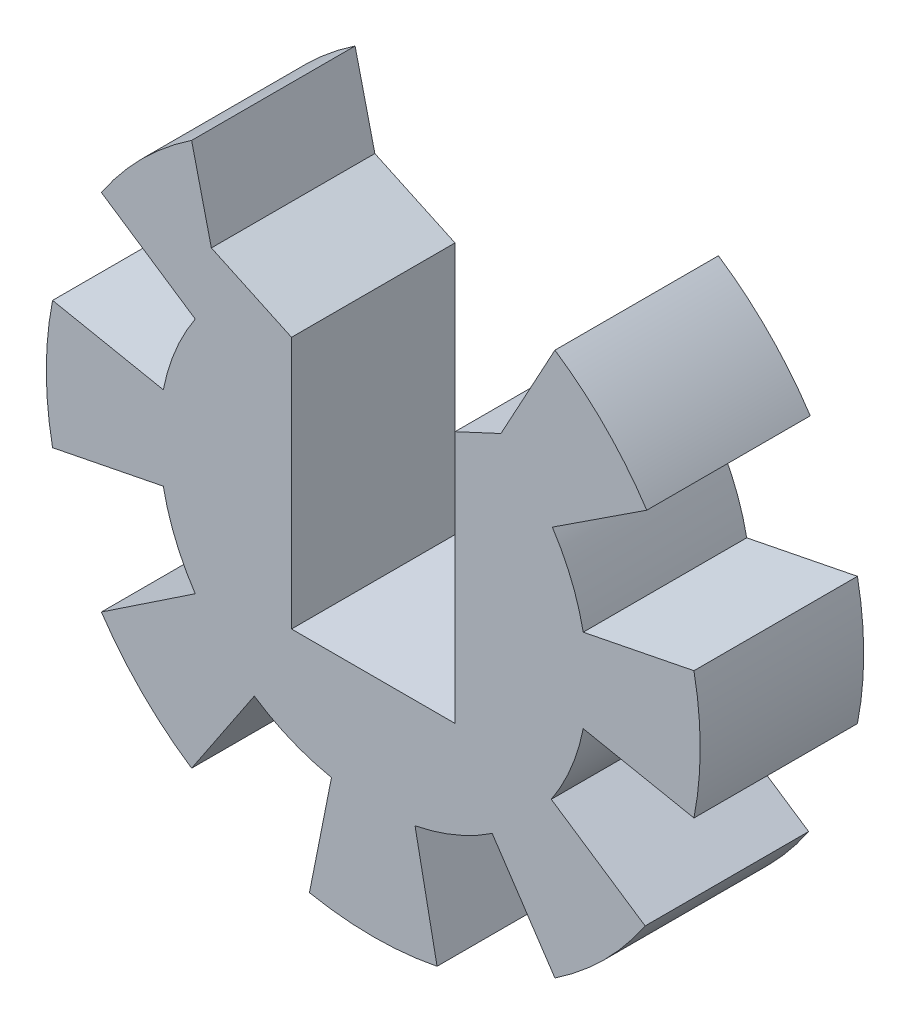
ISO-10303-21;
HEADER;
FILE_DESCRIPTION(('STEP AP214'),'2;1');
FILE_NAME('part.step','',(''),(''),'','','');
FILE_SCHEMA(('AUTOMOTIVE_DESIGN { 1 0 10303 214 1 1 1 1 }'));
ENDSEC;
DATA;
#1=APPLICATION_CONTEXT('core data for automotive mechanical design processes');
#2=APPLICATION_PROTOCOL_DEFINITION('international standard','automotive_design',2000,#1);
#3=PRODUCT_CONTEXT('',#1,'mechanical');
#4=PRODUCT('Part','Part','',(#3));
#5=PRODUCT_RELATED_PRODUCT_CATEGORY('part','',(#4));
#6=PRODUCT_DEFINITION_FORMATION('','',#4);
#7=PRODUCT_DEFINITION_CONTEXT('part definition',#1,'design');
#8=PRODUCT_DEFINITION('design','',#6,#7);
#9=PRODUCT_DEFINITION_SHAPE('','',#8);
#10=(LENGTH_UNIT() NAMED_UNIT(*) SI_UNIT(.MILLI.,.METRE.));
#11=(NAMED_UNIT(*) PLANE_ANGLE_UNIT() SI_UNIT($,.RADIAN.));
#12=(NAMED_UNIT(*) SI_UNIT($,.STERADIAN.) SOLID_ANGLE_UNIT());
#13=UNCERTAINTY_MEASURE_WITH_UNIT(LENGTH_MEASURE(1.E-05),#10,'distance_accuracy_value','');
#14=(GEOMETRIC_REPRESENTATION_CONTEXT(3) GLOBAL_UNCERTAINTY_ASSIGNED_CONTEXT((#13)) GLOBAL_UNIT_ASSIGNED_CONTEXT((#10,
#11,#12)) REPRESENTATION_CONTEXT('',''));
#15=CARTESIAN_POINT('',(0.,0.,0.));
#16=DIRECTION('',(0.,0.,1.));
#17=DIRECTION('',(1.,0.,0.));
#18=AXIS2_PLACEMENT_3D('',#15,#16,#17);
#19=CARTESIAN_POINT('',(2.34108386419354,-11.7694233648388,6.));
#20=DIRECTION('',(-0.98078528040323,-0.195090322016128,0.));
#21=DIRECTION('',(0.195090322016128,-0.980785280403231,0.));
#22=AXIS2_PLACEMENT_3D('',#19,#20,#21);
#23=PLANE('',#22);
#24=DIRECTION('',(-0.195090322016128,0.980785280403231,0.));
#25=VECTOR('',#24,1.);
#26=CARTESIAN_POINT('',(2.34108386419354,-11.7694233648388,0.));
#27=LINE('',#26,#25);
#28=CARTESIAN_POINT('',(2.34108386419354,-11.7694233648388,0.));
#29=VERTEX_POINT('',#28);
#30=CARTESIAN_POINT('',(1.53284416911292,-7.70612802665622,0.));
#31=VERTEX_POINT('',#30);
#32=EDGE_CURVE('E277',#29,#31,#27,.T.);
#33=ORIENTED_EDGE('',*,*,#32,.T.);
#34=DIRECTION('',(0.,0.,-1.));
#35=VECTOR('',#34,1.);
#36=CARTESIAN_POINT('',(1.53284416911292,-7.70612802665622,6.));
#37=LINE('',#36,#35);
#38=CARTESIAN_POINT('',(1.53284416911292,-7.70612802665622,6.));
#39=VERTEX_POINT('',#38);
#40=EDGE_CURVE('E41',#39,#31,#37,.T.);
#41=ORIENTED_EDGE('',*,*,#40,.F.);
#42=DIRECTION('',(-0.195090322016128,0.980785280403231,0.));
#43=VECTOR('',#42,1.);
#44=CARTESIAN_POINT('',(2.34108386419354,-11.7694233648388,6.));
#45=LINE('',#44,#43);
#46=CARTESIAN_POINT('',(2.34108386419354,-11.7694233648388,6.));
#47=VERTEX_POINT('',#46);
#48=EDGE_CURVE('E165',#47,#39,#45,.T.);
#49=ORIENTED_EDGE('',*,*,#48,.F.);
#50=DIRECTION('',(0.,0.,-1.));
#51=VECTOR('',#50,1.);
#52=CARTESIAN_POINT('',(2.34108386419354,-11.7694233648388,6.));
#53=LINE('',#52,#51);
#54=EDGE_CURVE('E11',#47,#29,#53,.T.);
#55=ORIENTED_EDGE('',*,*,#54,.T.);
#56=EDGE_LOOP('',(#33,#41,#49,#55));
#57=FACE_BOUND('',#56,.T.);
#58=ADVANCED_FACE('F33',(#57),#23,.F.);
#59=CARTESIAN_POINT('',(0.,0.,6.));
#60=DIRECTION('',(0.,0.,-1.));
#61=DIRECTION('',(-1.,0.,0.));
#62=AXIS2_PLACEMENT_3D('',#59,#60,#61);
#63=CYLINDRICAL_SURFACE('',#62,7.8571);
#64=CARTESIAN_POINT('',(0.,0.,0.));
#65=DIRECTION('',(0.,0.,1.));
#66=DIRECTION('',(1.,0.,0.));
#67=AXIS2_PLACEMENT_3D('',#64,#65,#66);
#68=CIRCLE('',#67,7.8571);
#69=CARTESIAN_POINT('',(4.36517087785832,-6.53293989082232,0.));
#70=VERTEX_POINT('',#69);
#71=EDGE_CURVE('E279',#31,#70,#68,.T.);
#72=ORIENTED_EDGE('',*,*,#71,.T.);
#73=DIRECTION('',(0.,0.,-1.));
#74=VECTOR('',#73,1.);
#75=CARTESIAN_POINT('',(4.36517087785832,-6.53293989082232,6.));
#76=LINE('',#75,#74);
#77=CARTESIAN_POINT('',(4.36517087785832,-6.53293989082232,6.));
#78=VERTEX_POINT('',#77);
#79=EDGE_CURVE('E423',#78,#70,#76,.T.);
#80=ORIENTED_EDGE('',*,*,#79,.F.);
#81=CARTESIAN_POINT('',(0.,0.,6.));
#82=DIRECTION('',(0.,0.,1.));
#83=DIRECTION('',(1.,0.,0.));
#84=AXIS2_PLACEMENT_3D('',#81,#82,#83);
#85=CIRCLE('',#84,7.8571);
#86=EDGE_CURVE('E431',#39,#78,#85,.T.);
#87=ORIENTED_EDGE('',*,*,#86,.F.);
#88=ORIENTED_EDGE('',*,*,#40,.T.);
#89=EDGE_LOOP('',(#72,#80,#87,#88));
#90=FACE_BOUND('',#89,.T.);
#91=ADVANCED_FACE('F429',(#90),#63,.T.);
#92=CARTESIAN_POINT('',(6.66684279623524,-9.97763534763054,6.));
#93=DIRECTION('',(0.831469612302544,0.555570233019604,0.));
#94=DIRECTION('',(-0.555570233019604,0.831469612302545,0.));
#95=AXIS2_PLACEMENT_3D('',#92,#93,#94);
#96=PLANE('',#95);
#97=DIRECTION('',(0.555570233019604,-0.831469612302544,0.));
#98=VECTOR('',#97,1.);
#99=CARTESIAN_POINT('',(6.66684279623524,-9.97763534763054,0.));
#100=LINE('',#99,#98);
#101=CARTESIAN_POINT('',(6.66684279623524,-9.97763534763054,0.));
#102=VERTEX_POINT('',#101);
#103=EDGE_CURVE('E281',#70,#102,#100,.T.);
#104=ORIENTED_EDGE('',*,*,#103,.T.);
#105=DIRECTION('',(0.,0.,-1.));
#106=VECTOR('',#105,1.);
#107=CARTESIAN_POINT('',(6.66684279623524,-9.97763534763054,6.));
#108=LINE('',#107,#106);
#109=CARTESIAN_POINT('',(6.66684279623524,-9.97763534763054,6.));
#110=VERTEX_POINT('',#109);
#111=EDGE_CURVE('E420',#110,#102,#108,.T.);
#112=ORIENTED_EDGE('',*,*,#111,.F.);
#113=DIRECTION('',(0.555570233019604,-0.831469612302544,0.));
#114=VECTOR('',#113,1.);
#115=CARTESIAN_POINT('',(6.66684279623524,-9.97763534763054,6.));
#116=LINE('',#115,#114);
#117=EDGE_CURVE('E449',#78,#110,#116,.T.);
#118=ORIENTED_EDGE('',*,*,#117,.F.);
#119=ORIENTED_EDGE('',*,*,#79,.T.);
#120=EDGE_LOOP('',(#104,#112,#118,#119));
#121=FACE_BOUND('',#120,.T.);
#122=ADVANCED_FACE('F440',(#121),#96,.F.);
#123=CARTESIAN_POINT('',(0.,0.,6.));
#124=DIRECTION('',(0.,0.,-1.));
#125=DIRECTION('',(-1.,0.,0.));
#126=AXIS2_PLACEMENT_3D('',#123,#124,#125);
#127=CYLINDRICAL_SURFACE('',#126,12.);
#128=CARTESIAN_POINT('',(0.,0.,0.));
#129=DIRECTION('',(0.,0.,1.));
#130=DIRECTION('',(1.,0.,0.));
#131=AXIS2_PLACEMENT_3D('',#128,#129,#130);
#132=CIRCLE('',#131,12.);
#133=CARTESIAN_POINT('',(9.97763534763046,-6.66684279623535,0.));
#134=VERTEX_POINT('',#133);
#135=EDGE_CURVE('E284',#102,#134,#132,.T.);
#136=ORIENTED_EDGE('',*,*,#135,.T.);
#137=DIRECTION('',(0.,0.,-1.));
#138=VECTOR('',#137,1.);
#139=CARTESIAN_POINT('',(9.97763534763046,-6.66684279623535,6.));
#140=LINE('',#139,#138);
#141=CARTESIAN_POINT('',(9.97763534763046,-6.66684279623535,6.));
#142=VERTEX_POINT('',#141);
#143=EDGE_CURVE('E417',#142,#134,#140,.T.);
#144=ORIENTED_EDGE('',*,*,#143,.F.);
#145=CARTESIAN_POINT('',(0.,0.,6.));
#146=DIRECTION('',(0.,0.,1.));
#147=DIRECTION('',(-1.,0.,0.));
#148=AXIS2_PLACEMENT_3D('',#145,#146,#147);
#149=CIRCLE('',#148,12.);
#150=EDGE_CURVE('E446',#110,#142,#149,.T.);
#151=ORIENTED_EDGE('',*,*,#150,.F.);
#152=ORIENTED_EDGE('',*,*,#111,.T.);
#153=EDGE_LOOP('',(#136,#144,#151,#152));
#154=FACE_BOUND('',#153,.T.);
#155=ADVANCED_FACE('F444',(#154),#127,.T.);
#156=CARTESIAN_POINT('',(9.97763534763046,-6.66684279623535,6.));
#157=DIRECTION('',(-0.555570233019613,-0.831469612302538,0.));
#158=DIRECTION('',(0.831469612302538,-0.555570233019613,0.));
#159=AXIS2_PLACEMENT_3D('',#156,#157,#158);
#160=PLANE('',#159);
#161=DIRECTION('',(-0.831469612302538,0.555570233019613,0.));
#162=VECTOR('',#161,1.);
#163=CARTESIAN_POINT('',(9.97763534763046,-6.66684279623535,0.));
#164=LINE('',#163,#162);
#165=CARTESIAN_POINT('',(6.53293989082227,-4.3651708778584,0.));
#166=VERTEX_POINT('',#165);
#167=EDGE_CURVE('E286',#134,#166,#164,.T.);
#168=ORIENTED_EDGE('',*,*,#167,.T.);
#169=DIRECTION('',(0.,0.,-1.));
#170=VECTOR('',#169,1.);
#171=CARTESIAN_POINT('',(6.53293989082227,-4.3651708778584,6.));
#172=LINE('',#171,#170);
#173=CARTESIAN_POINT('',(6.53293989082227,-4.3651708778584,6.));
#174=VERTEX_POINT('',#173);
#175=EDGE_CURVE('E414',#174,#166,#172,.T.);
#176=ORIENTED_EDGE('',*,*,#175,.F.);
#177=DIRECTION('',(-0.831469612302538,0.555570233019613,0.));
#178=VECTOR('',#177,1.);
#179=CARTESIAN_POINT('',(9.97763534763046,-6.66684279623535,6.));
#180=LINE('',#179,#178);
#181=EDGE_CURVE('E448',#142,#174,#180,.T.);
#182=ORIENTED_EDGE('',*,*,#181,.F.);
#183=ORIENTED_EDGE('',*,*,#143,.T.);
#184=EDGE_LOOP('',(#168,#176,#182,#183));
#185=FACE_BOUND('',#184,.T.);
#186=ADVANCED_FACE('F530',(#185),#160,.F.);
#187=CARTESIAN_POINT('',(0.,0.,6.));
#188=DIRECTION('',(0.,0.,-1.));
#189=DIRECTION('',(-1.,0.,0.));
#190=AXIS2_PLACEMENT_3D('',#187,#188,#189);
#191=CYLINDRICAL_SURFACE('',#190,7.8571);
#192=CARTESIAN_POINT('',(0.,0.,0.));
#193=DIRECTION('',(0.,0.,1.));
#194=DIRECTION('',(1.,0.,0.));
#195=AXIS2_PLACEMENT_3D('',#192,#193,#194);
#196=CIRCLE('',#195,7.8571);
#197=CARTESIAN_POINT('',(7.70612802665623,-1.5328441691129,0.));
#198=VERTEX_POINT('',#197);
#199=EDGE_CURVE('E288',#166,#198,#196,.T.);
#200=ORIENTED_EDGE('',*,*,#199,.T.);
#201=DIRECTION('',(0.,0.,-1.));
#202=VECTOR('',#201,1.);
#203=CARTESIAN_POINT('',(7.70612802665623,-1.5328441691129,6.));
#204=LINE('',#203,#202);
#205=CARTESIAN_POINT('',(7.70612802665623,-1.5328441691129,6.));
#206=VERTEX_POINT('',#205);
#207=EDGE_CURVE('E411',#206,#198,#204,.T.);
#208=ORIENTED_EDGE('',*,*,#207,.F.);
#209=CARTESIAN_POINT('',(0.,0.,6.));
#210=DIRECTION('',(0.,0.,1.));
#211=DIRECTION('',(1.,0.,0.));
#212=AXIS2_PLACEMENT_3D('',#209,#210,#211);
#213=CIRCLE('',#212,7.8571);
#214=EDGE_CURVE('E451',#174,#206,#213,.T.);
#215=ORIENTED_EDGE('',*,*,#214,.F.);
#216=ORIENTED_EDGE('',*,*,#175,.T.);
#217=EDGE_LOOP('',(#200,#208,#215,#216));
#218=FACE_BOUND('',#217,.T.);
#219=ADVANCED_FACE('F533',(#218),#191,.T.);
#220=CARTESIAN_POINT('',(11.7694233648388,-2.34108386419351,6.));
#221=DIRECTION('',(0.195090322016125,0.980785280403231,0.));
#222=DIRECTION('',(-0.980785280403231,0.195090322016125,0.));
#223=AXIS2_PLACEMENT_3D('',#220,#221,#222);
#224=PLANE('',#223);
#225=DIRECTION('',(0.980785280403231,-0.195090322016125,0.));
#226=VECTOR('',#225,1.);
#227=CARTESIAN_POINT('',(11.7694233648388,-2.34108386419351,0.));
#228=LINE('',#227,#226);
#229=CARTESIAN_POINT('',(11.7694233648388,-2.34108386419351,0.));
#230=VERTEX_POINT('',#229);
#231=EDGE_CURVE('E290',#198,#230,#228,.T.);
#232=ORIENTED_EDGE('',*,*,#231,.T.);
#233=DIRECTION('',(0.,0.,-1.));
#234=VECTOR('',#233,1.);
#235=CARTESIAN_POINT('',(11.7694233648388,-2.34108386419351,6.));
#236=LINE('',#235,#234);
#237=CARTESIAN_POINT('',(11.7694233648388,-2.34108386419351,6.));
#238=VERTEX_POINT('',#237);
#239=EDGE_CURVE('E408',#238,#230,#236,.T.);
#240=ORIENTED_EDGE('',*,*,#239,.F.);
#241=DIRECTION('',(0.980785280403231,-0.195090322016125,0.));
#242=VECTOR('',#241,1.);
#243=CARTESIAN_POINT('',(11.7694233648388,-2.34108386419351,6.));
#244=LINE('',#243,#242);
#245=EDGE_CURVE('E457',#206,#238,#244,.T.);
#246=ORIENTED_EDGE('',*,*,#245,.F.);
#247=ORIENTED_EDGE('',*,*,#207,.T.);
#248=EDGE_LOOP('',(#232,#240,#246,#247));
#249=FACE_BOUND('',#248,.T.);
#250=ADVANCED_FACE('F537',(#249),#224,.F.);
#251=CARTESIAN_POINT('',(0.,0.,6.));
#252=DIRECTION('',(0.,0.,-1.));
#253=DIRECTION('',(-1.,0.,0.));
#254=AXIS2_PLACEMENT_3D('',#251,#252,#253);
#255=CYLINDRICAL_SURFACE('',#254,12.);
#256=CARTESIAN_POINT('',(0.,0.,0.));
#257=DIRECTION('',(0.,0.,1.));
#258=DIRECTION('',(1.,0.,0.));
#259=AXIS2_PLACEMENT_3D('',#256,#257,#258);
#260=CIRCLE('',#259,12.);
#261=CARTESIAN_POINT('',(11.7694233648388,2.34108386419342,0.));
#262=VERTEX_POINT('',#261);
#263=EDGE_CURVE('E293',#230,#262,#260,.T.);
#264=ORIENTED_EDGE('',*,*,#263,.T.);
#265=DIRECTION('',(0.,0.,-1.));
#266=VECTOR('',#265,1.);
#267=CARTESIAN_POINT('',(11.7694233648388,2.34108386419342,6.));
#268=LINE('',#267,#266);
#269=CARTESIAN_POINT('',(11.7694233648388,2.34108386419342,6.));
#270=VERTEX_POINT('',#269);
#271=EDGE_CURVE('E405',#270,#262,#268,.T.);
#272=ORIENTED_EDGE('',*,*,#271,.F.);
#273=CARTESIAN_POINT('',(0.,0.,6.));
#274=DIRECTION('',(0.,0.,1.));
#275=DIRECTION('',(-1.,0.,0.));
#276=AXIS2_PLACEMENT_3D('',#273,#274,#275);
#277=CIRCLE('',#276,12.);
#278=EDGE_CURVE('E459',#238,#270,#277,.T.);
#279=ORIENTED_EDGE('',*,*,#278,.F.);
#280=ORIENTED_EDGE('',*,*,#239,.T.);
#281=EDGE_LOOP('',(#264,#272,#279,#280));
#282=FACE_BOUND('',#281,.T.);
#283=ADVANCED_FACE('F541',(#282),#255,.T.);
#284=CARTESIAN_POINT('',(11.7694233648388,2.34108386419341,6.));
#285=DIRECTION('',(0.195090322016118,-0.980785280403233,0.));
#286=DIRECTION('',(0.980785280403233,0.195090322016118,0.));
#287=AXIS2_PLACEMENT_3D('',#284,#285,#286);
#288=PLANE('',#287);
#289=DIRECTION('',(-0.980785280403232,-0.195090322016118,0.));
#290=VECTOR('',#289,1.);
#291=CARTESIAN_POINT('',(11.7694233648388,2.34108386419341,0.));
#292=LINE('',#291,#290);
#293=CARTESIAN_POINT('',(7.70612802665624,1.53284416911284,0.));
#294=VERTEX_POINT('',#293);
#295=EDGE_CURVE('E295',#262,#294,#292,.T.);
#296=ORIENTED_EDGE('',*,*,#295,.T.);
#297=DIRECTION('',(0.,0.,-1.));
#298=VECTOR('',#297,1.);
#299=CARTESIAN_POINT('',(7.70612802665624,1.53284416911284,6.));
#300=LINE('',#299,#298);
#301=CARTESIAN_POINT('',(7.70612802665624,1.53284416911284,6.));
#302=VERTEX_POINT('',#301);
#303=EDGE_CURVE('E402',#302,#294,#300,.T.);
#304=ORIENTED_EDGE('',*,*,#303,.F.);
#305=DIRECTION('',(-0.980785280403232,-0.195090322016118,0.));
#306=VECTOR('',#305,1.);
#307=CARTESIAN_POINT('',(11.7694233648388,2.34108386419341,6.));
#308=LINE('',#307,#306);
#309=EDGE_CURVE('E461',#270,#302,#308,.T.);
#310=ORIENTED_EDGE('',*,*,#309,.F.);
#311=ORIENTED_EDGE('',*,*,#271,.T.);
#312=EDGE_LOOP('',(#296,#304,#310,#311));
#313=FACE_BOUND('',#312,.T.);
#314=ADVANCED_FACE('F545',(#313),#288,.F.);
#315=CARTESIAN_POINT('',(0.,0.,6.));
#316=DIRECTION('',(0.,0.,-1.));
#317=DIRECTION('',(-1.,0.,0.));
#318=AXIS2_PLACEMENT_3D('',#315,#316,#317);
#319=CYLINDRICAL_SURFACE('',#318,7.8571);
#320=CARTESIAN_POINT('',(0.,0.,0.));
#321=DIRECTION('',(0.,0.,1.));
#322=DIRECTION('',(1.,0.,0.));
#323=AXIS2_PLACEMENT_3D('',#320,#321,#322);
#324=CIRCLE('',#323,7.8571);
#325=CARTESIAN_POINT('',(6.57230891594844,4.30566788353962,0.));
#326=VERTEX_POINT('',#325);
#327=EDGE_CURVE('E298',#294,#326,#324,.T.);
#328=ORIENTED_EDGE('',*,*,#327,.T.);
#329=DIRECTION('',(0.,0.,-1.));
#330=VECTOR('',#329,1.);
#331=CARTESIAN_POINT('',(6.57230891594844,4.30566788353962,6.));
#332=LINE('',#331,#330);
#333=CARTESIAN_POINT('',(6.57230891594844,4.30566788353962,6.));
#334=VERTEX_POINT('',#333);
#335=EDGE_CURVE('E399',#334,#326,#332,.T.);
#336=ORIENTED_EDGE('',*,*,#335,.F.);
#337=CARTESIAN_POINT('',(0.,0.,6.));
#338=DIRECTION('',(0.,0.,1.));
#339=DIRECTION('',(-1.,0.,0.));
#340=AXIS2_PLACEMENT_3D('',#337,#338,#339);
#341=CIRCLE('',#340,7.8571);
#342=EDGE_CURVE('E463',#302,#334,#341,.T.);
#343=ORIENTED_EDGE('',*,*,#342,.F.);
#344=ORIENTED_EDGE('',*,*,#303,.T.);
#345=EDGE_LOOP('',(#328,#336,#343,#344));
#346=FACE_BOUND('',#345,.T.);
#347=ADVANCED_FACE('F549',(#346),#319,.T.);
#348=CARTESIAN_POINT('',(10.0377629139735,6.57596500012415,6.));
#349=DIRECTION('',(-0.547997083343679,0.836480242831127,0.));
#350=DIRECTION('',(-0.836480242831127,-0.547997083343679,0.));
#351=AXIS2_PLACEMENT_3D('',#348,#349,#350);
#352=PLANE('',#351);
#353=DIRECTION('',(0.836480242831127,0.547997083343679,0.));
#354=VECTOR('',#353,1.);
#355=CARTESIAN_POINT('',(10.0377629139735,6.57596500012415,0.));
#356=LINE('',#355,#354);
#357=CARTESIAN_POINT('',(10.0377629139735,6.57596500012415,0.));
#358=VERTEX_POINT('',#357);
#359=EDGE_CURVE('E300',#326,#358,#356,.T.);
#360=ORIENTED_EDGE('',*,*,#359,.T.);
#361=DIRECTION('',(0.,0.,-1.));
#362=VECTOR('',#361,1.);
#363=CARTESIAN_POINT('',(10.0377629139735,6.57596500012415,6.));
#364=LINE('',#363,#362);
#365=CARTESIAN_POINT('',(10.0377629139735,6.57596500012415,6.));
#366=VERTEX_POINT('',#365);
#367=EDGE_CURVE('E396',#366,#358,#364,.T.);
#368=ORIENTED_EDGE('',*,*,#367,.F.);
#369=DIRECTION('',(0.836480242831127,0.547997083343679,0.));
#370=VECTOR('',#369,1.);
#371=CARTESIAN_POINT('',(10.0377629139735,6.57596500012415,6.));
#372=LINE('',#371,#370);
#373=EDGE_CURVE('E465',#334,#366,#372,.T.);
#374=ORIENTED_EDGE('',*,*,#373,.F.);
#375=ORIENTED_EDGE('',*,*,#335,.T.);
#376=EDGE_LOOP('',(#360,#368,#374,#375));
#377=FACE_BOUND('',#376,.T.);
#378=ADVANCED_FACE('F553',(#377),#352,.F.);
#379=CARTESIAN_POINT('',(0.,0.,6.));
#380=DIRECTION('',(0.,0.,-1.));
#381=DIRECTION('',(-1.,0.,0.));
#382=AXIS2_PLACEMENT_3D('',#379,#380,#381);
#383=CYLINDRICAL_SURFACE('',#382,12.);
#384=CARTESIAN_POINT('',(0.,0.,0.));
#385=DIRECTION('',(0.,0.,1.));
#386=DIRECTION('',(1.,0.,0.));
#387=AXIS2_PLACEMENT_3D('',#384,#385,#386);
#388=CIRCLE('',#387,12.);
#389=CARTESIAN_POINT('',(6.66684279623571,9.97763534763022,0.));
#390=VERTEX_POINT('',#389);
#391=EDGE_CURVE('E303',#358,#390,#388,.T.);
#392=ORIENTED_EDGE('',*,*,#391,.T.);
#393=DIRECTION('',(0.,0.,-1.));
#394=VECTOR('',#393,1.);
#395=CARTESIAN_POINT('',(6.66684279623571,9.97763534763022,6.));
#396=LINE('',#395,#394);
#397=CARTESIAN_POINT('',(6.66684279623571,9.97763534763022,6.));
#398=VERTEX_POINT('',#397);
#399=EDGE_CURVE('E393',#398,#390,#396,.T.);
#400=ORIENTED_EDGE('',*,*,#399,.F.);
#401=CARTESIAN_POINT('',(0.,0.,6.));
#402=DIRECTION('',(0.,0.,1.));
#403=DIRECTION('',(-1.,0.,0.));
#404=AXIS2_PLACEMENT_3D('',#401,#402,#403);
#405=CIRCLE('',#404,12.);
#406=EDGE_CURVE('E467',#366,#398,#405,.T.);
#407=ORIENTED_EDGE('',*,*,#406,.F.);
#408=ORIENTED_EDGE('',*,*,#367,.T.);
#409=EDGE_LOOP('',(#392,#400,#407,#408));
#410=FACE_BOUND('',#409,.T.);
#411=ADVANCED_FACE('F557',(#410),#383,.T.);
#412=CARTESIAN_POINT('',(6.66684279623571,9.97763534763023,6.));
#413=DIRECTION('',(0.878417635462471,-0.477893772410272,0.));
#414=DIRECTION('',(0.477893772410272,0.878417635462471,0.));
#415=AXIS2_PLACEMENT_3D('',#412,#413,#414);
#416=PLANE('',#415);
#417=DIRECTION('',(-0.477893772410272,-0.878417635462471,0.));
#418=VECTOR('',#417,1.);
#419=CARTESIAN_POINT('',(6.66684279623571,9.97763534763023,0.));
#420=LINE('',#419,#418);
#421=CARTESIAN_POINT('',(4.68697668651719,6.33843892567275,0.));
#422=VERTEX_POINT('',#421);
#423=EDGE_CURVE('E305',#390,#422,#420,.T.);
#424=ORIENTED_EDGE('',*,*,#423,.T.);
#425=DIRECTION('',(0.,0.,-1.));
#426=VECTOR('',#425,1.);
#427=CARTESIAN_POINT('',(4.68697668651719,6.33843892567275,6.));
#428=LINE('',#427,#426);
#429=CARTESIAN_POINT('',(4.68697668651719,6.33843892567275,6.));
#430=VERTEX_POINT('',#429);
#431=EDGE_CURVE('E390',#430,#422,#428,.T.);
#432=ORIENTED_EDGE('',*,*,#431,.F.);
#433=DIRECTION('',(-0.477893772410272,-0.878417635462471,0.));
#434=VECTOR('',#433,1.);
#435=CARTESIAN_POINT('',(6.66684279623571,9.97763534763023,6.));
#436=LINE('',#435,#434);
#437=EDGE_CURVE('E469',#398,#430,#436,.T.);
#438=ORIENTED_EDGE('',*,*,#437,.F.);
#439=ORIENTED_EDGE('',*,*,#399,.T.);
#440=EDGE_LOOP('',(#424,#432,#438,#439));
#441=FACE_BOUND('',#440,.T.);
#442=ADVANCED_FACE('F561',(#441),#416,.F.);
#443=CARTESIAN_POINT('',(3.00000000000002,5.55272394427944,6.));
#444=DIRECTION('',(0.422205456351356,-0.906500166920637,0.));
#445=DIRECTION('',(0.906500166920638,0.422205456351356,0.));
#446=AXIS2_PLACEMENT_3D('',#443,#444,#445);
#447=PLANE('',#446);
#448=DIRECTION('',(-0.906500166920637,-0.422205456351356,0.));
#449=VECTOR('',#448,1.);
#450=CARTESIAN_POINT('',(3.00000000000002,5.55272394427944,0.));
#451=LINE('',#450,#449);
#452=CARTESIAN_POINT('',(3.00000000000002,5.55272394427944,0.));
#453=VERTEX_POINT('',#452);
#454=EDGE_CURVE('E307',#422,#453,#451,.T.);
#455=ORIENTED_EDGE('',*,*,#454,.T.);
#456=DIRECTION('',(0.,0.,-1.));
#457=VECTOR('',#456,1.);
#458=CARTESIAN_POINT('',(3.00000000000002,5.55272394427944,6.));
#459=LINE('',#458,#457);
#460=CARTESIAN_POINT('',(3.00000000000002,5.55272394427944,6.));
#461=VERTEX_POINT('',#460);
#462=EDGE_CURVE('E387',#461,#453,#459,.T.);
#463=ORIENTED_EDGE('',*,*,#462,.F.);
#464=DIRECTION('',(-0.906500166920637,-0.422205456351356,0.));
#465=VECTOR('',#464,1.);
#466=CARTESIAN_POINT('',(3.00000000000002,5.55272394427944,6.));
#467=LINE('',#466,#465);
#468=EDGE_CURVE('E471',#430,#461,#467,.T.);
#469=ORIENTED_EDGE('',*,*,#468,.F.);
#470=ORIENTED_EDGE('',*,*,#431,.T.);
#471=EDGE_LOOP('',(#455,#463,#469,#470));
#472=FACE_BOUND('',#471,.T.);
#473=ADVANCED_FACE('F565',(#472),#447,.F.);
#474=CARTESIAN_POINT('',(3.00000000000002,5.55272394427944,6.));
#475=DIRECTION('',(1.,0.,0.));
#476=DIRECTION('',(0.,0.,-1.));
#477=AXIS2_PLACEMENT_3D('',#474,#475,#476);
#478=PLANE('',#477);
#479=DIRECTION('',(0.,-1.,0.));
#480=VECTOR('',#479,1.);
#481=CARTESIAN_POINT('',(3.00000000000002,5.55272394427944,0.));
#482=LINE('',#481,#480);
#483=CARTESIAN_POINT('',(3.00000000000002,-3.71913105572056,0.));
#484=VERTEX_POINT('',#483);
#485=EDGE_CURVE('E309',#453,#484,#482,.T.);
#486=ORIENTED_EDGE('',*,*,#485,.T.);
#487=DIRECTION('',(0.,0.,-1.));
#488=VECTOR('',#487,1.);
#489=CARTESIAN_POINT('',(3.00000000000002,-3.71913105572056,6.));
#490=LINE('',#489,#488);
#491=CARTESIAN_POINT('',(3.00000000000002,-3.71913105572056,6.));
#492=VERTEX_POINT('',#491);
#493=EDGE_CURVE('E384',#492,#484,#490,.T.);
#494=ORIENTED_EDGE('',*,*,#493,.F.);
#495=DIRECTION('',(0.,-1.,0.));
#496=VECTOR('',#495,1.);
#497=CARTESIAN_POINT('',(3.00000000000002,5.55272394427944,6.));
#498=LINE('',#497,#496);
#499=EDGE_CURVE('E473',#461,#492,#498,.T.);
#500=ORIENTED_EDGE('',*,*,#499,.F.);
#501=ORIENTED_EDGE('',*,*,#462,.T.);
#502=EDGE_LOOP('',(#486,#494,#500,#501));
#503=FACE_BOUND('',#502,.T.);
#504=ADVANCED_FACE('F569',(#503),#478,.F.);
#505=CARTESIAN_POINT('',(-2.99999999999999,-3.71913105572056,6.));
#506=DIRECTION('',(0.,-1.,0.));
#507=DIRECTION('',(0.,0.,-1.));
#508=AXIS2_PLACEMENT_3D('',#505,#506,#507);
#509=PLANE('',#508);
#510=DIRECTION('',(-1.,0.,0.));
#511=VECTOR('',#510,1.);
#512=CARTESIAN_POINT('',(-2.99999999999999,-3.71913105572056,0.));
#513=LINE('',#512,#511);
#514=CARTESIAN_POINT('',(-2.99999999999999,-3.71913105572056,0.));
#515=VERTEX_POINT('',#514);
#516=EDGE_CURVE('E311',#484,#515,#513,.T.);
#517=ORIENTED_EDGE('',*,*,#516,.T.);
#518=DIRECTION('',(0.,0.,-1.));
#519=VECTOR('',#518,1.);
#520=CARTESIAN_POINT('',(-2.99999999999999,-3.71913105572056,6.));
#521=LINE('',#520,#519);
#522=CARTESIAN_POINT('',(-2.99999999999999,-3.71913105572056,6.));
#523=VERTEX_POINT('',#522);
#524=EDGE_CURVE('E381',#523,#515,#521,.T.);
#525=ORIENTED_EDGE('',*,*,#524,.F.);
#526=DIRECTION('',(-1.,0.,0.));
#527=VECTOR('',#526,1.);
#528=CARTESIAN_POINT('',(-2.99999999999999,-3.71913105572056,6.));
#529=LINE('',#528,#527);
#530=EDGE_CURVE('E475',#492,#523,#529,.T.);
#531=ORIENTED_EDGE('',*,*,#530,.F.);
#532=ORIENTED_EDGE('',*,*,#493,.T.);
#533=EDGE_LOOP('',(#517,#525,#531,#532));
#534=FACE_BOUND('',#533,.T.);
#535=ADVANCED_FACE('F573',(#534),#509,.F.);
#536=CARTESIAN_POINT('',(-2.99999999999999,5.55272394427944,6.));
#537=DIRECTION('',(-1.,0.,0.));
#538=DIRECTION('',(0.,-1.,0.));
#539=AXIS2_PLACEMENT_3D('',#536,#537,#538);
#540=PLANE('',#539);
#541=DIRECTION('',(0.,1.,0.));
#542=VECTOR('',#541,1.);
#543=CARTESIAN_POINT('',(-2.99999999999999,5.55272394427944,0.));
#544=LINE('',#543,#542);
#545=CARTESIAN_POINT('',(-2.99999999999999,5.55272394427944,0.));
#546=VERTEX_POINT('',#545);
#547=EDGE_CURVE('E313',#515,#546,#544,.T.);
#548=ORIENTED_EDGE('',*,*,#547,.T.);
#549=DIRECTION('',(0.,0.,-1.));
#550=VECTOR('',#549,1.);
#551=CARTESIAN_POINT('',(-2.99999999999999,5.55272394427944,6.));
#552=LINE('',#551,#550);
#553=CARTESIAN_POINT('',(-2.99999999999999,5.55272394427944,6.));
#554=VERTEX_POINT('',#553);
#555=EDGE_CURVE('E378',#554,#546,#552,.T.);
#556=ORIENTED_EDGE('',*,*,#555,.F.);
#557=DIRECTION('',(0.,1.,0.));
#558=VECTOR('',#557,1.);
#559=CARTESIAN_POINT('',(-2.99999999999999,5.55272394427944,6.));
#560=LINE('',#559,#558);
#561=EDGE_CURVE('E477',#523,#554,#560,.T.);
#562=ORIENTED_EDGE('',*,*,#561,.F.);
#563=ORIENTED_EDGE('',*,*,#524,.T.);
#564=EDGE_LOOP('',(#548,#556,#562,#563));
#565=FACE_BOUND('',#564,.T.);
#566=ADVANCED_FACE('F577',(#565),#540,.F.);
#567=CARTESIAN_POINT('',(-5.94124960892418,6.92262069520613,6.));
#568=DIRECTION('',(-0.422205456351356,-0.906500166920637,0.));
#569=DIRECTION('',(0.906500166920638,-0.422205456351356,0.));
#570=AXIS2_PLACEMENT_3D('',#567,#568,#569);
#571=PLANE('',#570);
#572=DIRECTION('',(-0.906500166920638,0.422205456351356,0.));
#573=VECTOR('',#572,1.);
#574=CARTESIAN_POINT('',(-5.94124960892418,6.92262069520613,0.));
#575=LINE('',#574,#573);
#576=CARTESIAN_POINT('',(-5.94124960892418,6.92262069520613,0.));
#577=VERTEX_POINT('',#576);
#578=EDGE_CURVE('E315',#546,#577,#575,.T.);
#579=ORIENTED_EDGE('',*,*,#578,.T.);
#580=DIRECTION('',(0.,0.,-1.));
#581=VECTOR('',#580,1.);
#582=CARTESIAN_POINT('',(-5.94124960892418,6.92262069520613,6.));
#583=LINE('',#582,#581);
#584=CARTESIAN_POINT('',(-5.94124960892418,6.92262069520613,6.));
#585=VERTEX_POINT('',#584);
#586=EDGE_CURVE('E375',#585,#577,#583,.T.);
#587=ORIENTED_EDGE('',*,*,#586,.F.);
#588=DIRECTION('',(-0.906500166920638,0.422205456351356,0.));
#589=VECTOR('',#588,1.);
#590=CARTESIAN_POINT('',(-5.94124960892418,6.92262069520613,6.));
#591=LINE('',#590,#589);
#592=EDGE_CURVE('E479',#554,#585,#591,.T.);
#593=ORIENTED_EDGE('',*,*,#592,.F.);
#594=ORIENTED_EDGE('',*,*,#555,.T.);
#595=EDGE_LOOP('',(#579,#587,#593,#594));
#596=FACE_BOUND('',#595,.T.);
#597=ADVANCED_FACE('F581',(#596),#571,.F.);
#598=CARTESIAN_POINT('',(-6.66684279623525,9.97763534763053,6.));
#599=DIRECTION('',(-0.972934602682929,-0.231080632901614,0.));
#600=DIRECTION('',(0.231080632901614,-0.972934602682929,0.));
#601=AXIS2_PLACEMENT_3D('',#598,#599,#600);
#602=PLANE('',#601);
#603=DIRECTION('',(-0.231080632901614,0.972934602682929,0.));
#604=VECTOR('',#603,1.);
#605=CARTESIAN_POINT('',(-6.66684279623525,9.97763534763053,0.));
#606=LINE('',#605,#604);
#607=CARTESIAN_POINT('',(-6.66684279623525,9.97763534763053,0.));
#608=VERTEX_POINT('',#607);
#609=EDGE_CURVE('E317',#577,#608,#606,.T.);
#610=ORIENTED_EDGE('',*,*,#609,.T.);
#611=DIRECTION('',(0.,0.,-1.));
#612=VECTOR('',#611,1.);
#613=CARTESIAN_POINT('',(-6.66684279623525,9.97763534763053,6.));
#614=LINE('',#613,#612);
#615=CARTESIAN_POINT('',(-6.66684279623525,9.97763534763053,6.));
#616=VERTEX_POINT('',#615);
#617=EDGE_CURVE('E372',#616,#608,#614,.T.);
#618=ORIENTED_EDGE('',*,*,#617,.F.);
#619=DIRECTION('',(-0.231080632901614,0.972934602682929,0.));
#620=VECTOR('',#619,1.);
#621=CARTESIAN_POINT('',(-6.66684279623525,9.97763534763053,6.));
#622=LINE('',#621,#620);
#623=EDGE_CURVE('E481',#585,#616,#622,.T.);
#624=ORIENTED_EDGE('',*,*,#623,.F.);
#625=ORIENTED_EDGE('',*,*,#586,.T.);
#626=EDGE_LOOP('',(#610,#618,#624,#625));
#627=FACE_BOUND('',#626,.T.);
#628=ADVANCED_FACE('F585',(#627),#602,.F.);
#629=CARTESIAN_POINT('',(0.,0.,6.));
#630=DIRECTION('',(0.,0.,-1.));
#631=DIRECTION('',(-1.,0.,0.));
#632=AXIS2_PLACEMENT_3D('',#629,#630,#631);
#633=CYLINDRICAL_SURFACE('',#632,12.);
#634=CARTESIAN_POINT('',(0.,0.,0.));
#635=DIRECTION('',(0.,0.,1.));
#636=DIRECTION('',(1.,0.,0.));
#637=AXIS2_PLACEMENT_3D('',#634,#635,#636);
#638=CIRCLE('',#637,12.);
#639=CARTESIAN_POINT('',(-9.97763534763051,6.66684279623528,0.));
#640=VERTEX_POINT('',#639);
#641=EDGE_CURVE('E320',#608,#640,#638,.T.);
#642=ORIENTED_EDGE('',*,*,#641,.T.);
#643=DIRECTION('',(0.,0.,-1.));
#644=VECTOR('',#643,1.);
#645=CARTESIAN_POINT('',(-9.97763534763051,6.66684279623528,6.));
#646=LINE('',#645,#644);
#647=CARTESIAN_POINT('',(-9.97763534763051,6.66684279623528,6.));
#648=VERTEX_POINT('',#647);
#649=EDGE_CURVE('E369',#648,#640,#646,.T.);
#650=ORIENTED_EDGE('',*,*,#649,.F.);
#651=CARTESIAN_POINT('',(0.,0.,6.));
#652=DIRECTION('',(0.,0.,1.));
#653=DIRECTION('',(-1.,0.,0.));
#654=AXIS2_PLACEMENT_3D('',#651,#652,#653);
#655=CIRCLE('',#654,12.);
#656=EDGE_CURVE('E483',#616,#648,#655,.T.);
#657=ORIENTED_EDGE('',*,*,#656,.F.);
#658=ORIENTED_EDGE('',*,*,#617,.T.);
#659=EDGE_LOOP('',(#642,#650,#657,#658));
#660=FACE_BOUND('',#659,.T.);
#661=ADVANCED_FACE('F589',(#660),#633,.T.);
#662=CARTESIAN_POINT('',(-9.97763534763051,6.66684279623528,6.));
#663=DIRECTION('',(0.555570233019607,0.831469612302542,0.));
#664=DIRECTION('',(-0.831469612302542,0.555570233019607,0.));
#665=AXIS2_PLACEMENT_3D('',#662,#663,#664);
#666=PLANE('',#665);
#667=DIRECTION('',(0.831469612302542,-0.555570233019607,0.));
#668=VECTOR('',#667,1.);
#669=CARTESIAN_POINT('',(-9.97763534763051,6.66684279623528,0.));
#670=LINE('',#669,#668);
#671=CARTESIAN_POINT('',(-6.5329398908223,4.36517087785835,0.));
#672=VERTEX_POINT('',#671);
#673=EDGE_CURVE('E322',#640,#672,#670,.T.);
#674=ORIENTED_EDGE('',*,*,#673,.T.);
#675=DIRECTION('',(0.,0.,-1.));
#676=VECTOR('',#675,1.);
#677=CARTESIAN_POINT('',(-6.5329398908223,4.36517087785835,6.));
#678=LINE('',#677,#676);
#679=CARTESIAN_POINT('',(-6.5329398908223,4.36517087785835,6.));
#680=VERTEX_POINT('',#679);
#681=EDGE_CURVE('E366',#680,#672,#678,.T.);
#682=ORIENTED_EDGE('',*,*,#681,.F.);
#683=DIRECTION('',(0.831469612302542,-0.555570233019607,0.));
#684=VECTOR('',#683,1.);
#685=CARTESIAN_POINT('',(-9.97763534763051,6.66684279623528,6.));
#686=LINE('',#685,#684);
#687=EDGE_CURVE('E485',#648,#680,#686,.T.);
#688=ORIENTED_EDGE('',*,*,#687,.F.);
#689=ORIENTED_EDGE('',*,*,#649,.T.);
#690=EDGE_LOOP('',(#674,#682,#688,#689));
#691=FACE_BOUND('',#690,.T.);
#692=ADVANCED_FACE('F593',(#691),#666,.F.);
#693=CARTESIAN_POINT('',(0.,0.,6.));
#694=DIRECTION('',(0.,0.,-1.));
#695=DIRECTION('',(-1.,0.,0.));
#696=AXIS2_PLACEMENT_3D('',#693,#694,#695);
#697=CYLINDRICAL_SURFACE('',#696,7.8571);
#698=CARTESIAN_POINT('',(0.,0.,0.));
#699=DIRECTION('',(0.,0.,1.));
#700=DIRECTION('',(1.,0.,0.));
#701=AXIS2_PLACEMENT_3D('',#698,#699,#700);
#702=CIRCLE('',#701,7.8571);
#703=CARTESIAN_POINT('',(-7.70612802665624,1.53284416911284,0.));
#704=VERTEX_POINT('',#703);
#705=EDGE_CURVE('E324',#672,#704,#702,.T.);
#706=ORIENTED_EDGE('',*,*,#705,.T.);
#707=DIRECTION('',(0.,0.,-1.));
#708=VECTOR('',#707,1.);
#709=CARTESIAN_POINT('',(-7.70612802665624,1.53284416911284,6.));
#710=LINE('',#709,#708);
#711=CARTESIAN_POINT('',(-7.70612802665624,1.53284416911284,6.));
#712=VERTEX_POINT('',#711);
#713=EDGE_CURVE('E363',#712,#704,#710,.T.);
#714=ORIENTED_EDGE('',*,*,#713,.F.);
#715=CARTESIAN_POINT('',(0.,0.,6.));
#716=DIRECTION('',(0.,0.,1.));
#717=DIRECTION('',(1.,0.,0.));
#718=AXIS2_PLACEMENT_3D('',#715,#716,#717);
#719=CIRCLE('',#718,7.8571);
#720=EDGE_CURVE('E487',#680,#712,#719,.T.);
#721=ORIENTED_EDGE('',*,*,#720,.F.);
#722=ORIENTED_EDGE('',*,*,#681,.T.);
#723=EDGE_LOOP('',(#706,#714,#721,#722));
#724=FACE_BOUND('',#723,.T.);
#725=ADVANCED_FACE('F597',(#724),#697,.T.);
#726=CARTESIAN_POINT('',(-11.7694233648388,2.34108386419342,6.));
#727=DIRECTION('',(-0.195090322016119,-0.980785280403232,0.));
#728=DIRECTION('',(0.980785280403233,-0.195090322016119,0.));
#729=AXIS2_PLACEMENT_3D('',#726,#727,#728);
#730=PLANE('',#729);
#731=DIRECTION('',(-0.980785280403232,0.195090322016119,0.));
#732=VECTOR('',#731,1.);
#733=CARTESIAN_POINT('',(-11.7694233648388,2.34108386419342,0.));
#734=LINE('',#733,#732);
#735=CARTESIAN_POINT('',(-11.7694233648388,2.34108386419342,0.));
#736=VERTEX_POINT('',#735);
#737=EDGE_CURVE('E326',#704,#736,#734,.T.);
#738=ORIENTED_EDGE('',*,*,#737,.T.);
#739=DIRECTION('',(0.,0.,-1.));
#740=VECTOR('',#739,1.);
#741=CARTESIAN_POINT('',(-11.7694233648388,2.34108386419342,6.));
#742=LINE('',#741,#740);
#743=CARTESIAN_POINT('',(-11.7694233648388,2.34108386419342,6.));
#744=VERTEX_POINT('',#743);
#745=EDGE_CURVE('E360',#744,#736,#742,.T.);
#746=ORIENTED_EDGE('',*,*,#745,.F.);
#747=DIRECTION('',(-0.980785280403232,0.195090322016119,0.));
#748=VECTOR('',#747,1.);
#749=CARTESIAN_POINT('',(-11.7694233648388,2.34108386419342,6.));
#750=LINE('',#749,#748);
#751=EDGE_CURVE('E489',#712,#744,#750,.T.);
#752=ORIENTED_EDGE('',*,*,#751,.F.);
#753=ORIENTED_EDGE('',*,*,#713,.T.);
#754=EDGE_LOOP('',(#738,#746,#752,#753));
#755=FACE_BOUND('',#754,.T.);
#756=ADVANCED_FACE('F601',(#755),#730,.F.);
#757=CARTESIAN_POINT('',(0.,0.,6.));
#758=DIRECTION('',(0.,0.,-1.));
#759=DIRECTION('',(-1.,0.,0.));
#760=AXIS2_PLACEMENT_3D('',#757,#758,#759);
#761=CYLINDRICAL_SURFACE('',#760,12.);
#762=CARTESIAN_POINT('',(0.,0.,0.));
#763=DIRECTION('',(0.,0.,1.));
#764=DIRECTION('',(1.,0.,0.));
#765=AXIS2_PLACEMENT_3D('',#762,#763,#764);
#766=CIRCLE('',#765,12.);
#767=CARTESIAN_POINT('',(-11.7694233648388,-2.34108386419349,0.));
#768=VERTEX_POINT('',#767);
#769=EDGE_CURVE('E329',#736,#768,#766,.T.);
#770=ORIENTED_EDGE('',*,*,#769,.T.);
#771=DIRECTION('',(0.,0.,-1.));
#772=VECTOR('',#771,1.);
#773=CARTESIAN_POINT('',(-11.7694233648388,-2.34108386419349,6.));
#774=LINE('',#773,#772);
#775=CARTESIAN_POINT('',(-11.7694233648388,-2.34108386419349,6.));
#776=VERTEX_POINT('',#775);
#777=EDGE_CURVE('E357',#776,#768,#774,.T.);
#778=ORIENTED_EDGE('',*,*,#777,.F.);
#779=CARTESIAN_POINT('',(0.,0.,6.));
#780=DIRECTION('',(0.,0.,1.));
#781=DIRECTION('',(-1.,0.,0.));
#782=AXIS2_PLACEMENT_3D('',#779,#780,#781);
#783=CIRCLE('',#782,12.);
#784=EDGE_CURVE('E491',#744,#776,#783,.T.);
#785=ORIENTED_EDGE('',*,*,#784,.F.);
#786=ORIENTED_EDGE('',*,*,#745,.T.);
#787=EDGE_LOOP('',(#770,#778,#785,#786));
#788=FACE_BOUND('',#787,.T.);
#789=ADVANCED_FACE('F605',(#788),#761,.T.);
#790=CARTESIAN_POINT('',(-11.7694233648388,-2.34108386419349,6.));
#791=DIRECTION('',(-0.195090322016124,0.980785280403231,0.));
#792=DIRECTION('',(-0.980785280403231,-0.195090322016124,0.));
#793=AXIS2_PLACEMENT_3D('',#790,#791,#792);
#794=PLANE('',#793);
#795=DIRECTION('',(0.980785280403231,0.195090322016124,0.));
#796=VECTOR('',#795,1.);
#797=CARTESIAN_POINT('',(-11.7694233648388,-2.34108386419349,0.));
#798=LINE('',#797,#796);
#799=CARTESIAN_POINT('',(-7.70612802665623,-1.53284416911289,0.));
#800=VERTEX_POINT('',#799);
#801=EDGE_CURVE('E331',#768,#800,#798,.T.);
#802=ORIENTED_EDGE('',*,*,#801,.T.);
#803=DIRECTION('',(0.,0.,-1.));
#804=VECTOR('',#803,1.);
#805=CARTESIAN_POINT('',(-7.70612802665623,-1.53284416911289,6.));
#806=LINE('',#805,#804);
#807=CARTESIAN_POINT('',(-7.70612802665623,-1.53284416911289,6.));
#808=VERTEX_POINT('',#807);
#809=EDGE_CURVE('E354',#808,#800,#806,.T.);
#810=ORIENTED_EDGE('',*,*,#809,.F.);
#811=DIRECTION('',(0.980785280403231,0.195090322016124,0.));
#812=VECTOR('',#811,1.);
#813=CARTESIAN_POINT('',(-11.7694233648388,-2.34108386419349,6.));
#814=LINE('',#813,#812);
#815=EDGE_CURVE('E493',#776,#808,#814,.T.);
#816=ORIENTED_EDGE('',*,*,#815,.F.);
#817=ORIENTED_EDGE('',*,*,#777,.T.);
#818=EDGE_LOOP('',(#802,#810,#816,#817));
#819=FACE_BOUND('',#818,.T.);
#820=ADVANCED_FACE('F609',(#819),#794,.F.);
#821=CARTESIAN_POINT('',(0.,0.,6.));
#822=DIRECTION('',(0.,0.,-1.));
#823=DIRECTION('',(-1.,0.,0.));
#824=AXIS2_PLACEMENT_3D('',#821,#822,#823);
#825=CYLINDRICAL_SURFACE('',#824,7.8571);
#826=CARTESIAN_POINT('',(0.,0.,0.));
#827=DIRECTION('',(0.,0.,1.));
#828=DIRECTION('',(1.,0.,0.));
#829=AXIS2_PLACEMENT_3D('',#826,#827,#828);
#830=CIRCLE('',#829,7.8571);
#831=CARTESIAN_POINT('',(-6.53293989082228,-4.36517087785839,0.));
#832=VERTEX_POINT('',#831);
#833=EDGE_CURVE('E333',#800,#832,#830,.T.);
#834=ORIENTED_EDGE('',*,*,#833,.T.);
#835=DIRECTION('',(0.,0.,-1.));
#836=VECTOR('',#835,1.);
#837=CARTESIAN_POINT('',(-6.53293989082228,-4.36517087785839,6.));
#838=LINE('',#837,#836);
#839=CARTESIAN_POINT('',(-6.53293989082228,-4.36517087785839,6.));
#840=VERTEX_POINT('',#839);
#841=EDGE_CURVE('E351',#840,#832,#838,.T.);
#842=ORIENTED_EDGE('',*,*,#841,.F.);
#843=CARTESIAN_POINT('',(0.,0.,6.));
#844=DIRECTION('',(0.,0.,1.));
#845=DIRECTION('',(1.,0.,0.));
#846=AXIS2_PLACEMENT_3D('',#843,#844,#845);
#847=CIRCLE('',#846,7.8571);
#848=EDGE_CURVE('E495',#808,#840,#847,.T.);
#849=ORIENTED_EDGE('',*,*,#848,.F.);
#850=ORIENTED_EDGE('',*,*,#809,.T.);
#851=EDGE_LOOP('',(#834,#842,#849,#850));
#852=FACE_BOUND('',#851,.T.);
#853=ADVANCED_FACE('F613',(#852),#825,.T.);
#854=CARTESIAN_POINT('',(-9.97763534763047,-6.66684279623534,6.));
#855=DIRECTION('',(0.555570233019612,-0.831469612302539,0.));
#856=DIRECTION('',(0.831469612302539,0.555570233019612,0.));
#857=AXIS2_PLACEMENT_3D('',#854,#855,#856);
#858=PLANE('',#857);
#859=DIRECTION('',(-0.831469612302539,-0.555570233019612,0.));
#860=VECTOR('',#859,1.);
#861=CARTESIAN_POINT('',(-9.97763534763047,-6.66684279623534,0.));
#862=LINE('',#861,#860);
#863=CARTESIAN_POINT('',(-9.97763534763047,-6.66684279623534,0.));
#864=VERTEX_POINT('',#863);
#865=EDGE_CURVE('E335',#832,#864,#862,.T.);
#866=ORIENTED_EDGE('',*,*,#865,.T.);
#867=DIRECTION('',(0.,0.,-1.));
#868=VECTOR('',#867,1.);
#869=CARTESIAN_POINT('',(-9.97763534763047,-6.66684279623534,6.));
#870=LINE('',#869,#868);
#871=CARTESIAN_POINT('',(-9.97763534763047,-6.66684279623534,6.));
#872=VERTEX_POINT('',#871);
#873=EDGE_CURVE('E348',#872,#864,#870,.T.);
#874=ORIENTED_EDGE('',*,*,#873,.F.);
#875=DIRECTION('',(-0.831469612302539,-0.555570233019612,0.));
#876=VECTOR('',#875,1.);
#877=CARTESIAN_POINT('',(-9.97763534763047,-6.66684279623534,6.));
#878=LINE('',#877,#876);
#879=EDGE_CURVE('E497',#840,#872,#878,.T.);
#880=ORIENTED_EDGE('',*,*,#879,.F.);
#881=ORIENTED_EDGE('',*,*,#841,.T.);
#882=EDGE_LOOP('',(#866,#874,#880,#881));
#883=FACE_BOUND('',#882,.T.);
#884=ADVANCED_FACE('F503',(#883),#858,.F.);
#885=CARTESIAN_POINT('',(0.,0.,6.));
#886=DIRECTION('',(0.,0.,-1.));
#887=DIRECTION('',(-1.,0.,0.));
#888=AXIS2_PLACEMENT_3D('',#885,#886,#887);
#889=CYLINDRICAL_SURFACE('',#888,12.);
#890=CARTESIAN_POINT('',(0.,0.,0.));
#891=DIRECTION('',(0.,0.,1.));
#892=DIRECTION('',(1.,0.,0.));
#893=AXIS2_PLACEMENT_3D('',#890,#891,#892);
#894=CIRCLE('',#893,12.);
#895=CARTESIAN_POINT('',(-6.66684279623525,-9.97763534763054,0.));
#896=VERTEX_POINT('',#895);
#897=EDGE_CURVE('E338',#864,#896,#894,.T.);
#898=ORIENTED_EDGE('',*,*,#897,.T.);
#899=DIRECTION('',(0.,0.,-1.));
#900=VECTOR('',#899,1.);
#901=CARTESIAN_POINT('',(-6.66684279623525,-9.97763534763054,6.));
#902=LINE('',#901,#900);
#903=CARTESIAN_POINT('',(-6.66684279623525,-9.97763534763054,6.));
#904=VERTEX_POINT('',#903);
#905=EDGE_CURVE('E266',#904,#896,#902,.T.);
#906=ORIENTED_EDGE('',*,*,#905,.F.);
#907=CARTESIAN_POINT('',(0.,0.,6.));
#908=DIRECTION('',(0.,0.,1.));
#909=DIRECTION('',(-1.,0.,0.));
#910=AXIS2_PLACEMENT_3D('',#907,#908,#909);
#911=CIRCLE('',#910,12.);
#912=EDGE_CURVE('E257',#872,#904,#911,.T.);
#913=ORIENTED_EDGE('',*,*,#912,.F.);
#914=ORIENTED_EDGE('',*,*,#873,.T.);
#915=EDGE_LOOP('',(#898,#906,#913,#914));
#916=FACE_BOUND('',#915,.T.);
#917=ADVANCED_FACE('F506',(#916),#889,.T.);
#918=CARTESIAN_POINT('',(-6.66684279623525,-9.97763534763053,6.));
#919=DIRECTION('',(-0.831469612302544,0.555570233019604,0.));
#920=DIRECTION('',(-0.555570233019604,-0.831469612302544,0.));
#921=AXIS2_PLACEMENT_3D('',#918,#919,#920);
#922=PLANE('',#921);
#923=DIRECTION('',(0.555570233019604,0.831469612302544,0.));
#924=VECTOR('',#923,1.);
#925=CARTESIAN_POINT('',(-6.66684279623525,-9.97763534763053,0.));
#926=LINE('',#925,#924);
#927=CARTESIAN_POINT('',(-4.36517087785833,-6.53293989082232,0.));
#928=VERTEX_POINT('',#927);
#929=EDGE_CURVE('E265',#896,#928,#926,.T.);
#930=ORIENTED_EDGE('',*,*,#929,.T.);
#931=DIRECTION('',(0.,0.,-1.));
#932=VECTOR('',#931,1.);
#933=CARTESIAN_POINT('',(-4.36517087785833,-6.53293989082232,6.));
#934=LINE('',#933,#932);
#935=CARTESIAN_POINT('',(-4.36517087785833,-6.53293989082232,6.));
#936=VERTEX_POINT('',#935);
#937=EDGE_CURVE('E262',#936,#928,#934,.T.);
#938=ORIENTED_EDGE('',*,*,#937,.F.);
#939=DIRECTION('',(0.555570233019604,0.831469612302544,0.));
#940=VECTOR('',#939,1.);
#941=CARTESIAN_POINT('',(-6.66684279623525,-9.97763534763053,6.));
#942=LINE('',#941,#940);
#943=EDGE_CURVE('E251',#904,#936,#942,.T.);
#944=ORIENTED_EDGE('',*,*,#943,.F.);
#945=ORIENTED_EDGE('',*,*,#905,.T.);
#946=EDGE_LOOP('',(#930,#938,#944,#945));
#947=FACE_BOUND('',#946,.T.);
#948=ADVANCED_FACE('F263',(#947),#922,.F.);
#949=CARTESIAN_POINT('',(0.,0.,6.));
#950=DIRECTION('',(0.,0.,-1.));
#951=DIRECTION('',(-1.,0.,0.));
#952=AXIS2_PLACEMENT_3D('',#949,#950,#951);
#953=CYLINDRICAL_SURFACE('',#952,7.8571);
#954=CARTESIAN_POINT('',(0.,0.,0.));
#955=DIRECTION('',(0.,0.,1.));
#956=DIRECTION('',(1.,0.,0.));
#957=AXIS2_PLACEMENT_3D('',#954,#955,#956);
#958=CIRCLE('',#957,7.8571);
#959=CARTESIAN_POINT('',(-1.53284416911282,-7.70612802665624,0.));
#960=VERTEX_POINT('',#959);
#961=EDGE_CURVE('E151',#928,#960,#958,.T.);
#962=ORIENTED_EDGE('',*,*,#961,.T.);
#963=DIRECTION('',(0.,0.,-1.));
#964=VECTOR('',#963,1.);
#965=CARTESIAN_POINT('',(-1.53284416911282,-7.70612802665624,6.));
#966=LINE('',#965,#964);
#967=CARTESIAN_POINT('',(-1.53284416911282,-7.70612802665624,6.));
#968=VERTEX_POINT('',#967);
#969=EDGE_CURVE('E267',#968,#960,#966,.T.);
#970=ORIENTED_EDGE('',*,*,#969,.F.);
#971=CARTESIAN_POINT('',(0.,0.,6.));
#972=DIRECTION('',(0.,0.,1.));
#973=DIRECTION('',(1.,0.,0.));
#974=AXIS2_PLACEMENT_3D('',#971,#972,#973);
#975=CIRCLE('',#974,7.8571);
#976=EDGE_CURVE('E255',#936,#968,#975,.T.);
#977=ORIENTED_EDGE('',*,*,#976,.F.);
#978=ORIENTED_EDGE('',*,*,#937,.T.);
#979=EDGE_LOOP('',(#962,#970,#977,#978));
#980=FACE_BOUND('',#979,.T.);
#981=ADVANCED_FACE('F269',(#980),#953,.T.);
#982=CARTESIAN_POINT('',(-2.34108386419338,-11.7694233648388,6.));
#983=DIRECTION('',(0.980785280403233,-0.195090322016115,0.));
#984=DIRECTION('',(0.195090322016115,0.980785280403233,0.));
#985=AXIS2_PLACEMENT_3D('',#982,#983,#984);
#986=PLANE('',#985);
#987=DIRECTION('',(-0.195090322016115,-0.980785280403233,0.));
#988=VECTOR('',#987,1.);
#989=CARTESIAN_POINT('',(-2.34108386419338,-11.7694233648388,0.));
#990=LINE('',#989,#988);
#991=CARTESIAN_POINT('',(-2.34108386419338,-11.7694233648388,0.));
#992=VERTEX_POINT('',#991);
#993=EDGE_CURVE('E158',#960,#992,#990,.T.);
#994=ORIENTED_EDGE('',*,*,#993,.T.);
#995=DIRECTION('',(0.,0.,-1.));
#996=VECTOR('',#995,1.);
#997=CARTESIAN_POINT('',(-2.34108386419338,-11.7694233648388,6.));
#998=LINE('',#997,#996);
#999=CARTESIAN_POINT('',(-2.34108386419338,-11.7694233648388,6.));
#1000=VERTEX_POINT('',#999);
#1001=EDGE_CURVE('E273',#1000,#992,#998,.T.);
#1002=ORIENTED_EDGE('',*,*,#1001,.F.);
#1003=DIRECTION('',(-0.195090322016115,-0.980785280403233,0.));
#1004=VECTOR('',#1003,1.);
#1005=CARTESIAN_POINT('',(-2.34108386419338,-11.7694233648388,6.));
#1006=LINE('',#1005,#1004);
#1007=EDGE_CURVE('E271',#968,#1000,#1006,.T.);
#1008=ORIENTED_EDGE('',*,*,#1007,.F.);
#1009=ORIENTED_EDGE('',*,*,#969,.T.);
#1010=EDGE_LOOP('',(#994,#1002,#1008,#1009));
#1011=FACE_BOUND('',#1010,.T.);
#1012=ADVANCED_FACE('F508',(#1011),#986,.F.);
#1013=CARTESIAN_POINT('',(0.,0.,6.));
#1014=DIRECTION('',(0.,0.,-1.));
#1015=DIRECTION('',(-1.,0.,0.));
#1016=AXIS2_PLACEMENT_3D('',#1013,#1014,#1015);
#1017=CYLINDRICAL_SURFACE('',#1016,12.);
#1018=CARTESIAN_POINT('',(0.,0.,0.));
#1019=DIRECTION('',(0.,0.,1.));
#1020=DIRECTION('',(-1.,0.,0.));
#1021=AXIS2_PLACEMENT_3D('',#1018,#1019,#1020);
#1022=CIRCLE('',#1021,12.);
#1023=EDGE_CURVE('E343',#992,#29,#1022,.T.);
#1024=ORIENTED_EDGE('',*,*,#1023,.T.);
#1025=ORIENTED_EDGE('',*,*,#54,.F.);
#1026=CARTESIAN_POINT('',(0.,0.,6.));
#1027=DIRECTION('',(0.,0.,1.));
#1028=DIRECTION('',(1.,0.,0.));
#1029=AXIS2_PLACEMENT_3D('',#1026,#1027,#1028);
#1030=CIRCLE('',#1029,12.);
#1031=EDGE_CURVE('E49',#1000,#47,#1030,.T.);
#1032=ORIENTED_EDGE('',*,*,#1031,.F.);
#1033=ORIENTED_EDGE('',*,*,#1001,.T.);
#1034=EDGE_LOOP('',(#1024,#1025,#1032,#1033));
#1035=FACE_BOUND('',#1034,.T.);
#1036=ADVANCED_FACE('F507',(#1035),#1017,.T.);
#1037=CARTESIAN_POINT('',(0.,0.,6.));
#1038=DIRECTION('',(0.,0.,1.));
#1039=DIRECTION('',(1.,0.,0.));
#1040=AXIS2_PLACEMENT_3D('',#1037,#1038,#1039);
#1041=PLANE('',#1040);
#1042=ORIENTED_EDGE('',*,*,#1031,.T.);
#1043=ORIENTED_EDGE('',*,*,#48,.T.);
#1044=ORIENTED_EDGE('',*,*,#86,.T.);
#1045=ORIENTED_EDGE('',*,*,#117,.T.);
#1046=ORIENTED_EDGE('',*,*,#150,.T.);
#1047=ORIENTED_EDGE('',*,*,#181,.T.);
#1048=ORIENTED_EDGE('',*,*,#214,.T.);
#1049=ORIENTED_EDGE('',*,*,#245,.T.);
#1050=ORIENTED_EDGE('',*,*,#278,.T.);
#1051=ORIENTED_EDGE('',*,*,#309,.T.);
#1052=ORIENTED_EDGE('',*,*,#342,.T.);
#1053=ORIENTED_EDGE('',*,*,#373,.T.);
#1054=ORIENTED_EDGE('',*,*,#406,.T.);
#1055=ORIENTED_EDGE('',*,*,#437,.T.);
#1056=ORIENTED_EDGE('',*,*,#468,.T.);
#1057=ORIENTED_EDGE('',*,*,#499,.T.);
#1058=ORIENTED_EDGE('',*,*,#530,.T.);
#1059=ORIENTED_EDGE('',*,*,#561,.T.);
#1060=ORIENTED_EDGE('',*,*,#592,.T.);
#1061=ORIENTED_EDGE('',*,*,#623,.T.);
#1062=ORIENTED_EDGE('',*,*,#656,.T.);
#1063=ORIENTED_EDGE('',*,*,#687,.T.);
#1064=ORIENTED_EDGE('',*,*,#720,.T.);
#1065=ORIENTED_EDGE('',*,*,#751,.T.);
#1066=ORIENTED_EDGE('',*,*,#784,.T.);
#1067=ORIENTED_EDGE('',*,*,#815,.T.);
#1068=ORIENTED_EDGE('',*,*,#848,.T.);
#1069=ORIENTED_EDGE('',*,*,#879,.T.);
#1070=ORIENTED_EDGE('',*,*,#912,.T.);
#1071=ORIENTED_EDGE('',*,*,#943,.T.);
#1072=ORIENTED_EDGE('',*,*,#976,.T.);
#1073=ORIENTED_EDGE('',*,*,#1007,.T.);
#1074=EDGE_LOOP('',(#1042,#1043,#1044,#1045,#1046,#1047,#1048,#1049,#1050,#1051,#1052,#1053,
#1054,#1055,#1056,#1057,#1058,#1059,#1060,#1061,#1062,#1063,#1064,#1065,#1066,#1067,#1068,#1069,
#1070,#1071,#1072,#1073));
#1075=FACE_BOUND('',#1074,.T.);
#1076=ADVANCED_FACE('F253',(#1075),#1041,.T.);
#1077=CARTESIAN_POINT('',(0.,0.,0.));
#1078=DIRECTION('',(0.,0.,1.));
#1079=DIRECTION('',(1.,0.,0.));
#1080=AXIS2_PLACEMENT_3D('',#1077,#1078,#1079);
#1081=PLANE('',#1080);
#1082=ORIENTED_EDGE('',*,*,#32,.F.);
#1083=ORIENTED_EDGE('',*,*,#1023,.F.);
#1084=ORIENTED_EDGE('',*,*,#993,.F.);
#1085=ORIENTED_EDGE('',*,*,#961,.F.);
#1086=ORIENTED_EDGE('',*,*,#929,.F.);
#1087=ORIENTED_EDGE('',*,*,#897,.F.);
#1088=ORIENTED_EDGE('',*,*,#865,.F.);
#1089=ORIENTED_EDGE('',*,*,#833,.F.);
#1090=ORIENTED_EDGE('',*,*,#801,.F.);
#1091=ORIENTED_EDGE('',*,*,#769,.F.);
#1092=ORIENTED_EDGE('',*,*,#737,.F.);
#1093=ORIENTED_EDGE('',*,*,#705,.F.);
#1094=ORIENTED_EDGE('',*,*,#673,.F.);
#1095=ORIENTED_EDGE('',*,*,#641,.F.);
#1096=ORIENTED_EDGE('',*,*,#609,.F.);
#1097=ORIENTED_EDGE('',*,*,#578,.F.);
#1098=ORIENTED_EDGE('',*,*,#547,.F.);
#1099=ORIENTED_EDGE('',*,*,#516,.F.);
#1100=ORIENTED_EDGE('',*,*,#485,.F.);
#1101=ORIENTED_EDGE('',*,*,#454,.F.);
#1102=ORIENTED_EDGE('',*,*,#423,.F.);
#1103=ORIENTED_EDGE('',*,*,#391,.F.);
#1104=ORIENTED_EDGE('',*,*,#359,.F.);
#1105=ORIENTED_EDGE('',*,*,#327,.F.);
#1106=ORIENTED_EDGE('',*,*,#295,.F.);
#1107=ORIENTED_EDGE('',*,*,#263,.F.);
#1108=ORIENTED_EDGE('',*,*,#231,.F.);
#1109=ORIENTED_EDGE('',*,*,#199,.F.);
#1110=ORIENTED_EDGE('',*,*,#167,.F.);
#1111=ORIENTED_EDGE('',*,*,#135,.F.);
#1112=ORIENTED_EDGE('',*,*,#103,.F.);
#1113=ORIENTED_EDGE('',*,*,#71,.F.);
#1114=EDGE_LOOP('',(#1082,#1083,#1084,#1085,#1086,#1087,#1088,#1089,#1090,#1091,#1092,#1093,
#1094,#1095,#1096,#1097,#1098,#1099,#1100,#1101,#1102,#1103,#1104,#1105,#1106,#1107,#1108,#1109,
#1110,#1111,#1112,#1113));
#1115=FACE_BOUND('',#1114,.T.);
#1116=ADVANCED_FACE('F435',(#1115),#1081,.F.);
#1117=CLOSED_SHELL('',(#58,#91,#122,#155,#186,#219,#250,#283,#314,#347,#378,#411,#442,#473,#504,
#535,#566,#597,#628,#661,#692,#725,#756,#789,#820,#853,#884,#917,#948,#981,#1012,#1036,#1076,#1116));
#1118=MANIFOLD_SOLID_BREP('B2',#1117);
#1119=ADVANCED_BREP_SHAPE_REPRESENTATION('',(#18,#1118),#14);
#1120=SHAPE_DEFINITION_REPRESENTATION(#9,#1119);
ENDSEC;
END-ISO-10303-21;
